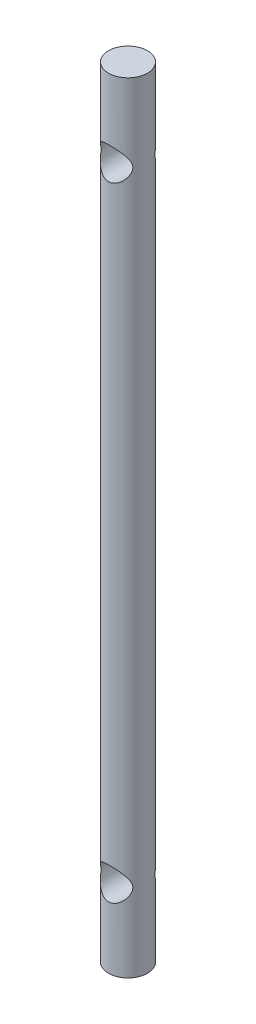
ISO-10303-21;
HEADER;
FILE_DESCRIPTION(('STEP AP214'),'2;1');
FILE_NAME('part.step','',(''),(''),'','','');
FILE_SCHEMA(('AUTOMOTIVE_DESIGN { 1 0 10303 214 1 1 1 1 }'));
ENDSEC;
DATA;
#1=APPLICATION_CONTEXT('core data for automotive mechanical design processes');
#2=APPLICATION_PROTOCOL_DEFINITION('international standard','automotive_design',2000,#1);
#3=PRODUCT_CONTEXT('',#1,'mechanical');
#4=PRODUCT('Part','Part','',(#3));
#5=PRODUCT_RELATED_PRODUCT_CATEGORY('part','',(#4));
#6=PRODUCT_DEFINITION_FORMATION('','',#4);
#7=PRODUCT_DEFINITION_CONTEXT('part definition',#1,'design');
#8=PRODUCT_DEFINITION('design','',#6,#7);
#9=PRODUCT_DEFINITION_SHAPE('','',#8);
#10=(LENGTH_UNIT() NAMED_UNIT(*) SI_UNIT(.MILLI.,.METRE.));
#11=(NAMED_UNIT(*) PLANE_ANGLE_UNIT() SI_UNIT($,.RADIAN.));
#12=(NAMED_UNIT(*) SI_UNIT($,.STERADIAN.) SOLID_ANGLE_UNIT());
#13=UNCERTAINTY_MEASURE_WITH_UNIT(LENGTH_MEASURE(1.E-05),#10,'distance_accuracy_value','');
#14=(GEOMETRIC_REPRESENTATION_CONTEXT(3) GLOBAL_UNCERTAINTY_ASSIGNED_CONTEXT((#13)) GLOBAL_UNIT_ASSIGNED_CONTEXT((#10,
#11,#12)) REPRESENTATION_CONTEXT('',''));
#15=CARTESIAN_POINT('',(0.,0.,0.));
#16=DIRECTION('',(0.,0.,1.));
#17=DIRECTION('',(1.,0.,0.));
#18=AXIS2_PLACEMENT_3D('',#15,#16,#17);
#19=CARTESIAN_POINT('',(0.,127.,0.));
#20=DIRECTION('',(0.,-1.,0.));
#21=DIRECTION('',(0.,0.,-1.));
#22=AXIS2_PLACEMENT_3D('',#19,#20,#21);
#23=CYLINDRICAL_SURFACE('',#22,3.175);
#24=CARTESIAN_POINT('',(0.,127.,0.));
#25=DIRECTION('',(0.,1.,0.));
#26=DIRECTION('',(0.,0.,1.));
#27=AXIS2_PLACEMENT_3D('',#24,#25,#26);
#28=CIRCLE('',#27,3.175);
#29=CARTESIAN_POINT('',(0.,127.,3.175));
#30=VERTEX_POINT('',#29);
#31=EDGE_CURVE('E10',#30,#30,#28,.T.);
#32=ORIENTED_EDGE('',*,*,#31,.F.);
#33=EDGE_LOOP('',(#32));
#34=FACE_BOUND('',#33,.T.);
#35=CARTESIAN_POINT('',(0.,0.,0.));
#36=DIRECTION('',(0.,1.,0.));
#37=DIRECTION('',(0.,0.,1.));
#38=AXIS2_PLACEMENT_3D('',#35,#36,#37);
#39=CIRCLE('',#38,3.175);
#40=CARTESIAN_POINT('',(0.,0.,3.175));
#41=VERTEX_POINT('',#40);
#42=EDGE_CURVE('E46',#41,#41,#39,.T.);
#43=ORIENTED_EDGE('',*,*,#42,.T.);
#44=EDGE_LOOP('',(#43));
#45=FACE_BOUND('',#44,.T.);
#46=CARTESIAN_POINT('',(-2.6035,12.7,1.81725417869928));
#47=CARTESIAN_POINT('',(-2.60349380703893,12.6056522915322,1.81726960519073));
#48=CARTESIAN_POINT('',(-2.59830904840763,12.5111405078217,1.82475945800134));
#49=CARTESIAN_POINT('',(-2.57808860042119,12.3251602366585,1.85320291134145));
#50=CARTESIAN_POINT('',(-2.56301943103733,12.2337032065457,1.87420226598136));
#51=CARTESIAN_POINT('',(-2.51694337247042,12.022627240234,1.93586405062697));
#52=CARTESIAN_POINT('',(-2.48209442276683,11.9051761393774,1.9809339390405));
#53=CARTESIAN_POINT('',(-2.39841904985947,11.6800407597469,2.08146538459981));
#54=CARTESIAN_POINT('',(-2.34954960473286,11.572387907154,2.13695874238255));
#55=CARTESIAN_POINT('',(-2.25541715860351,11.3969043389212,2.23537692454374));
#56=CARTESIAN_POINT('',(-2.2133430346896,11.3266945022097,2.27718022507128));
#57=CARTESIAN_POINT('',(-2.12304867110549,11.1908489097998,2.36159191688069));
#58=CARTESIAN_POINT('',(-2.07482597637227,11.1252149975039,2.40420062393305));
#59=CARTESIAN_POINT('',(-1.92114005012042,10.9353666398222,2.53129287769606));
#60=CARTESIAN_POINT('',(-1.80650430308042,10.8179184294719,2.61521372312124));
#61=CARTESIAN_POINT('',(-1.57945159624831,10.62615817513,2.75681725436884));
#62=CARTESIAN_POINT('',(-1.47145254679039,10.5479453202648,2.8163418253493));
#63=CARTESIAN_POINT('',(-1.24097732698785,10.40733046106,2.92519319791981));
#64=CARTESIAN_POINT('',(-1.11852469347476,10.3449032578057,2.97453622901349));
#65=CARTESIAN_POINT('',(-0.882754596866585,10.2479896804999,3.05189691940021));
#66=CARTESIAN_POINT('',(-0.771369427082402,10.2105688311945,3.08210619165948));
#67=CARTESIAN_POINT('',(-0.542099638614502,10.150815481225,3.13056626479759));
#68=CARTESIAN_POINT('',(-0.424218717568863,10.1284744905443,3.14882379437707));
#69=CARTESIAN_POINT('',(-0.184702399776176,10.1002525297829,3.17191312658879));
#70=CARTESIAN_POINT('',(-0.0630542442020661,10.0944355623768,3.17669272448434));
#71=CARTESIAN_POINT('',(0.179598439609459,10.0998688596393,3.1722376933656));
#72=CARTESIAN_POINT('',(0.300602973008787,10.1111189872204,3.16300317691645));
#73=CARTESIAN_POINT('',(0.530754495807861,10.1486722187031,3.13234403759877));
#74=CARTESIAN_POINT('',(0.640171714002751,10.1739998535061,3.1117098386675));
#75=CARTESIAN_POINT('',(0.852647558606555,10.237579592308,3.06032310242028));
#76=CARTESIAN_POINT('',(0.955704504285415,10.2758350954051,3.0295679040662));
#77=CARTESIAN_POINT('',(1.16279452849434,10.3676001702961,2.95662894565897));
#78=CARTESIAN_POINT('',(1.2660745726746,10.4221756446305,2.91366368632402));
#79=CARTESIAN_POINT('',(1.46207443006603,10.5427311167065,2.82041889385542));
#80=CARTESIAN_POINT('',(1.55478943860704,10.608716269169,2.77013605638324));
#81=CARTESIAN_POINT('',(1.74736466909495,10.7652216438746,2.65376673632885));
#82=CARTESIAN_POINT('',(1.84471745269194,10.8579919915534,2.58656568240451));
#83=CARTESIAN_POINT('',(2.02339604233255,11.0562445223615,2.44932530286629));
#84=CARTESIAN_POINT('',(2.10469763983113,11.1617455256786,2.37928187928248));
#85=CARTESIAN_POINT('',(2.24848726914474,11.3812196890884,2.24373588676197));
#86=CARTESIAN_POINT('',(2.31150741926268,11.4947985976659,2.1781597457541));
#87=CARTESIAN_POINT('',(2.42117649292599,11.7338994443531,2.05553877920543));
#88=CARTESIAN_POINT('',(2.46786131888551,11.8593944105906,1.99847540447659));
#89=CARTESIAN_POINT('',(2.52912696585605,12.0759078545479,1.91981912423537));
#90=CARTESIAN_POINT('',(2.5492213873144,12.1633570383594,1.89282496311961));
#91=CARTESIAN_POINT('',(2.58042133786671,12.3424311995639,1.85007036811107));
#92=CARTESIAN_POINT('',(2.59154938910397,12.4340450997925,1.83428179946868));
#93=CARTESIAN_POINT('',(2.60395334095435,12.6201217578389,1.81664298167926));
#94=CARTESIAN_POINT('',(2.60514737674104,12.7146017602056,1.81490855376892));
#95=CARTESIAN_POINT('',(2.59733303011709,12.9023006848884,1.82606625849704));
#96=CARTESIAN_POINT('',(2.58831318049629,12.995518070649,1.83897483097672));
#97=CARTESIAN_POINT('',(2.55818983228077,13.1961278594062,1.88070528016295));
#98=CARTESIAN_POINT('',(2.53503143895886,13.3026294075129,1.91219215437187));
#99=CARTESIAN_POINT('',(2.47715409814926,13.5083438569671,1.98658919501497));
#100=CARTESIAN_POINT('',(2.44239853217996,13.6075324405335,2.02953545771445));
#101=CARTESIAN_POINT('',(2.37187757105399,13.7764456503839,2.11116922838265));
#102=CARTESIAN_POINT('',(2.33818697759601,13.847696130628,2.14856077116876));
#103=CARTESIAN_POINT('',(2.26508109926628,13.9859784609942,2.22550176038988));
#104=CARTESIAN_POINT('',(2.22566296224328,14.0530081853242,2.26505227576864));
#105=CARTESIAN_POINT('',(2.09898018038973,14.24808755516,2.38503209760887));
#106=CARTESIAN_POINT('',(2.00330616957861,14.3700826149601,2.46676624298373));
#107=CARTESIAN_POINT('',(1.84210171074324,14.5415311546607,2.58688783587489));
#108=CARTESIAN_POINT('',(1.78450998934586,14.5974319232116,2.62704185301191));
#109=CARTESIAN_POINT('',(1.66355898166607,14.7043201667134,2.70524849645464));
#110=CARTESIAN_POINT('',(1.60019956353601,14.7553075292905,2.74330107469019));
#111=CARTESIAN_POINT('',(1.46797932136913,14.8517255573894,2.81626530862939));
#112=CARTESIAN_POINT('',(1.39913273588328,14.8971698770936,2.85118462395024));
#113=CARTESIAN_POINT('',(1.2560546202533,14.9819850768828,2.91704561602491));
#114=CARTESIAN_POINT('',(1.18182574004628,15.0213589162747,2.94798922966511));
#115=CARTESIAN_POINT('',(0.999413105069472,15.106859448454,3.01570335266716));
#116=CARTESIAN_POINT('',(0.888951563089919,15.14996386044,3.0502940300014));
#117=CARTESIAN_POINT('',(0.660433666577568,15.2211783058276,3.10778240966677));
#118=CARTESIAN_POINT('',(0.542383240561661,15.2492998882162,3.1306891175921));
#119=CARTESIAN_POINT('',(0.301034653873182,15.2889386678215,3.16304955150389));
#120=CARTESIAN_POINT('',(0.177712958272432,15.3003711105559,3.17243460571653));
#121=CARTESIAN_POINT('',(-0.0695487107797177,15.3055053283863,3.17664410680545));
#122=CARTESIAN_POINT('',(-0.193488604293605,15.2992093394575,3.17147038988767));
#123=CARTESIAN_POINT('',(-0.428208810946592,15.2705517809296,3.14802958864769));
#124=CARTESIAN_POINT('',(-0.539260005543839,15.2494857953008,3.13081865904161));
#125=CARTESIAN_POINT('',(-0.755647208780161,15.1939321240832,3.08574914882455));
#126=CARTESIAN_POINT('',(-0.860982389096538,15.1594424991261,3.0578890296919));
#127=CARTESIAN_POINT('',(-1.07072462242002,15.0759901930671,2.99116521603351));
#128=CARTESIAN_POINT('',(-1.17461764477315,15.0262266017417,2.95169965368096));
#129=CARTESIAN_POINT('',(-1.37254157716372,14.9152300957006,2.86504169788145));
#130=CARTESIAN_POINT('',(-1.46656491895475,14.8539884782238,2.81784344486658));
#131=CARTESIAN_POINT('',(-1.68524901110361,14.6910734064275,2.69493634929465));
#132=CARTESIAN_POINT('',(-1.80403918577009,14.5837795783829,2.61611808882817));
#133=CARTESIAN_POINT('',(-1.96516590073709,14.409567353474,2.49465758406211));
#134=CARTESIAN_POINT('',(-2.01609578271388,14.3491832441238,2.45356727170546));
#135=CARTESIAN_POINT('',(-2.11224457503145,14.2240887104516,2.37129603165292));
#136=CARTESIAN_POINT('',(-2.15746514344285,14.1593795505773,2.33011513381555));
#137=CARTESIAN_POINT('',(-2.26728826205007,13.985917221163,2.22458028123042));
#138=CARTESIAN_POINT('',(-2.32744666809876,13.8738351577155,2.16099283135989));
#139=CARTESIAN_POINT('',(-2.43194934699224,13.6382725322719,2.0426543650848));
#140=CARTESIAN_POINT('',(-2.47633599046081,13.5148236493447,1.98787989299024));
#141=CARTESIAN_POINT('',(-2.53529061200704,13.2988236228063,1.91166237827773));
#142=CARTESIAN_POINT('',(-2.55486432902738,13.2094574558188,1.88518150104208));
#143=CARTESIAN_POINT('',(-2.58457629617021,13.0266045031825,1.8442487329831));
#144=CARTESIAN_POINT('',(-2.59475037550996,12.9331347992831,1.82975118696474));
#145=CARTESIAN_POINT('',(-2.60102447982524,12.8158660417275,1.82079575180877));
#146=CARTESIAN_POINT('',(-2.60195127919733,12.7927266651667,1.81947139270039));
#147=CARTESIAN_POINT('',(-2.60318985311492,12.7463948389957,1.81769863473897));
#148=CARTESIAN_POINT('',(-2.60350152299875,12.723202381026,1.81725038495232));
#149=CARTESIAN_POINT('',(-2.6035,12.7,1.81725417869928));
#150=B_SPLINE_CURVE_WITH_KNOTS('',3,(#46,#47,#48,#49,#50,#51,#52,#53,#54,#55,#56,#57,#58,#59,
#60,#61,#62,#63,#64,#65,#66,#67,#68,#69,#70,#71,#72,#73,#74,#75,#76,#77,#78,#79,#80,#81,#82,#83,
#84,#85,#86,#87,#88,#89,#90,#91,#92,#93,#94,#95,#96,#97,#98,#99,#100,#101,#102,#103,#104,#105,
#106,#107,#108,#109,#110,#111,#112,#113,#114,#115,#116,#117,#118,#119,#120,#121,#122,#123,#124,
#125,#126,#127,#128,#129,#130,#131,#132,#133,#134,#135,#136,#137,#138,#139,#140,#141,#142,#143,
#144,#145,#146,#147,#148,#149),.UNSPECIFIED.,.T.,.F.,(4,2,2,2,2,2,2,2,2,2,2,2,2,2,2,2,2,2,2,2,2,
2,2,2,2,2,2,2,2,2,2,2,2,2,2,2,2,2,2,2,2,2,2,2,2,2,2,2,2,2,2,4),(0.,0.282939510307461,
0.566842363978402,0.956270704776369,1.34690702768739,1.62230695710977,1.89781719737606,
2.44774539088221,2.88426263354912,3.32007859335295,3.68252927239652,4.04477571977008,
4.40842335953073,4.77206807839132,5.11319028142707,5.45440224490685,5.82644196446266,
6.19865020723959,6.64806919839079,7.09816091444782,7.53340602702876,7.96768844192595,
8.24785671153458,8.52731902827848,8.80908209660932,9.09116181647813,9.42962283661691,
9.76916283494951,10.0305293359004,10.2920264387289,10.8151808853685,11.0841598691664,
11.3531450032797,11.6214535587844,11.8896308997666,12.2585823277594,12.6272489495625,
12.9977813798354,13.3682670792854,13.7097644119182,14.0513111003958,14.4152597845521,
14.7794855430674,15.3117004825252,15.5786168057556,15.8454554332829,16.2708086130978,
16.6950102905371,16.9797499495291,17.2633997147977,17.3329695404304,17.4025512020528),.UNSPECIFIED.);
#151=CARTESIAN_POINT('',(-2.6035,12.7,1.81725417869928));
#152=VERTEX_POINT('',#151);
#153=EDGE_CURVE('E53',#152,#152,#150,.T.);
#154=ORIENTED_EDGE('',*,*,#153,.F.);
#155=EDGE_LOOP('',(#154));
#156=FACE_BOUND('',#155,.T.);
#157=CARTESIAN_POINT('',(0.,15.3035,-3.175));
#158=CARTESIAN_POINT('',(0.124123475975315,15.3034893581908,-3.17498963844609));
#159=CARTESIAN_POINT('',(0.248399817811965,15.2945499532605,-3.16764822022756));
#160=CARTESIAN_POINT('',(0.492915685238948,15.2594097445047,-3.13893180286522));
#161=CARTESIAN_POINT('',(0.613147071737957,15.233176097969,-3.11753010274403));
#162=CARTESIAN_POINT('',(0.845370064526018,15.1653814220387,-3.06269871701765));
#163=CARTESIAN_POINT('',(0.95740883594244,15.123918058066,-3.02934570561062));
#164=CARTESIAN_POINT('',(1.1719899729014,15.0277668764952,-2.95297497446787));
#165=CARTESIAN_POINT('',(1.27453147910821,14.9730778638216,-2.90995638137086));
#166=CARTESIAN_POINT('',(1.50418874828167,14.8307009338172,-2.79992252111318));
#167=CARTESIAN_POINT('',(1.62685974340384,14.7382213815472,-2.72984396144292));
#168=CARTESIAN_POINT('',(1.85222572926916,14.5358996551492,-2.58226149625843));
#169=CARTESIAN_POINT('',(1.95486191966328,14.4260080387235,-2.50473670147969));
#170=CARTESIAN_POINT('',(2.09419892563397,14.2486486776039,-2.38720547545905));
#171=CARTESIAN_POINT('',(2.13853064808069,14.1868430792235,-2.34746698005741));
#172=CARTESIAN_POINT('',(2.22185003224185,14.0591943987958,-2.26876311834294));
#173=CARTESIAN_POINT('',(2.26083592730141,13.9933499923837,-2.2297980112354));
#174=CARTESIAN_POINT('',(2.33318274771518,13.8577398573863,-2.15397803623534));
#175=CARTESIAN_POINT('',(2.36655779505138,13.7879845812898,-2.11711802939653));
#176=CARTESIAN_POINT('',(2.42746797872266,13.6442963754813,-2.04699254721169));
#177=CARTESIAN_POINT('',(2.4550081415199,13.5703671115664,-2.01372399022973));
#178=CARTESIAN_POINT('',(2.50658873716791,13.40934482567,-1.94923911746055));
#179=CARTESIAN_POINT('',(2.52985620476328,13.3217181629825,-1.91870498324858));
#180=CARTESIAN_POINT('',(2.56739303486915,13.1417193499684,-1.86818689698901));
#181=CARTESIAN_POINT('',(2.58168481380992,13.0493596498964,-1.84817668237134));
#182=CARTESIAN_POINT('',(2.60028691219318,12.8605602665468,-1.82192817278465));
#183=CARTESIAN_POINT('',(2.60448888485103,12.7640875203456,-1.81583940257808));
#184=CARTESIAN_POINT('',(2.60211315740838,12.571537150346,-1.81923902416289));
#185=CARTESIAN_POINT('',(2.59553081649723,12.4754597144996,-1.82873412215905));
#186=CARTESIAN_POINT('',(2.57094397805907,12.2760690024166,-1.86315400856163));
#187=CARTESIAN_POINT('',(2.55170022727413,12.1732135391498,-1.88974469136245));
#188=CARTESIAN_POINT('',(2.50232253625902,11.9739084648961,-1.95464781624411));
#189=CARTESIAN_POINT('',(2.47215411497204,11.8774802940466,-1.992997312748));
#190=CARTESIAN_POINT('',(2.41011212928527,11.7123202113051,-2.06731302203854));
#191=CARTESIAN_POINT('',(2.38013051431426,11.6422189185222,-2.101892495004));
#192=CARTESIAN_POINT('',(2.31477445283779,11.5059559661491,-2.17366213153368));
#193=CARTESIAN_POINT('',(2.27939711926158,11.4397964421815,-2.21085368695476));
#194=CARTESIAN_POINT('',(2.16543772342221,11.2469181152341,-2.32442703413848));
#195=CARTESIAN_POINT('',(2.07905422537912,11.1258671508787,-2.40277435290893));
#196=CARTESIAN_POINT('',(1.88227893075192,10.8946766809139,-2.56012511257143));
#197=CARTESIAN_POINT('',(1.77105880109225,10.7851748312205,-2.6390273887326));
#198=CARTESIAN_POINT('',(1.5270779114991,10.5855394009579,-2.78727841350138));
#199=CARTESIAN_POINT('',(1.39437058393797,10.4953590337454,-2.85665009058514));
#200=CARTESIAN_POINT('',(1.14717455706693,10.3598303714,-2.96269415784094));
#201=CARTESIAN_POINT('',(1.03734481071852,10.3089448591673,-3.00314655826614));
#202=CARTESIAN_POINT('',(0.808472770456184,10.2221942364831,-3.07266264818784));
#203=CARTESIAN_POINT('',(0.689437039605883,10.1863185401902,-3.10173436310676));
#204=CARTESIAN_POINT('',(0.444137934137689,10.1315699656462,-3.14626597447226));
#205=CARTESIAN_POINT('',(0.317832509624789,10.112809427501,-3.16163592073425));
#206=CARTESIAN_POINT('',(0.0629120037225163,10.0941295640756,-3.17693912736038));
#207=CARTESIAN_POINT('',(-0.0657020679860151,10.0942021936836,-3.17687897911894));
#208=CARTESIAN_POINT('',(-0.307380967024342,10.112164759431,-3.16216462368221));
#209=CARTESIAN_POINT('',(-0.420683678390824,10.1282200119679,-3.14901320282353));
#210=CARTESIAN_POINT('',(-0.642383248669001,10.1744534621768,-3.11136927044028));
#211=CARTESIAN_POINT('',(-0.750779218579718,10.2046342079558,-3.08687471272837));
#212=CARTESIAN_POINT('',(-0.964119386725469,10.2788642094524,-3.02717779548715));
#213=CARTESIAN_POINT('',(-1.06880671667246,10.3233653623829,-2.99162801371886));
#214=CARTESIAN_POINT('',(-1.26901924959805,10.4239559720396,-2.9123596023041));
#215=CARTESIAN_POINT('',(-1.36454176445307,10.4800488135905,-2.86863858697831));
#216=CARTESIAN_POINT('',(-1.58678190557676,10.6298485880596,-2.75401917991626));
#217=CARTESIAN_POINT('',(-1.70808861490192,10.7290981722438,-2.67976797972566));
#218=CARTESIAN_POINT('',(-1.87403957004749,10.8910751115127,-2.56382769666462));
#219=CARTESIAN_POINT('',(-1.92679707161641,10.9474043435339,-2.52431861471153));
#220=CARTESIAN_POINT('',(-2.02691784622182,11.0642350861497,-2.44464891997431));
#221=CARTESIAN_POINT('',(-2.07428337510765,11.1247348347821,-2.40448858774876));
#222=CARTESIAN_POINT('',(-2.16433735799769,11.2508734660719,-2.32378756743908));
#223=CARTESIAN_POINT('',(-2.20693199095685,11.3165825337329,-2.2832521174344));
#224=CARTESIAN_POINT('',(-2.28640153755374,11.4522954993897,-2.20366818575308));
#225=CARTESIAN_POINT('',(-2.32327376010173,11.522301396599,-2.16462041016165));
#226=CARTESIAN_POINT('',(-2.39086352498482,11.6664187065179,-2.08971969393377));
#227=CARTESIAN_POINT('',(-2.42160771889491,11.7405104687395,-2.05385331274569));
#228=CARTESIAN_POINT('',(-2.4766450600724,11.8931462093896,-1.98713910557181));
#229=CARTESIAN_POINT('',(-2.50094648664365,11.9716843148846,-1.95628485867469));
#230=CARTESIAN_POINT('',(-2.54327599370942,12.1365419418237,-1.90095794348242));
#231=CARTESIAN_POINT('',(-2.56100550798422,12.2230485609389,-1.87679933394888));
#232=CARTESIAN_POINT('',(-2.5876534922232,12.3996743541574,-1.83989414331906));
#233=CARTESIAN_POINT('',(-2.59659432871273,12.4897837473916,-1.82711860097366));
#234=CARTESIAN_POINT('',(-2.60495254879583,12.6719743701564,-1.81518976727652));
#235=CARTESIAN_POINT('',(-2.60430968129299,12.7640644369915,-1.81612265795785));
#236=CARTESIAN_POINT('',(-2.59341679087731,12.9465617189978,-1.8316354853639));
#237=CARTESIAN_POINT('',(-2.58315195253364,13.0369661196851,-1.8462364674874));
#238=CARTESIAN_POINT('',(-2.5499767392694,13.2373457338148,-1.89188125022431));
#239=CARTESIAN_POINT('',(-2.52441782222472,13.3460856322685,-1.92627916500784));
#240=CARTESIAN_POINT('',(-2.46129495688756,13.5557524115751,-2.00629861106379));
#241=CARTESIAN_POINT('',(-2.42369344788066,13.6566536035454,-2.05195515399701));
#242=CARTESIAN_POINT('',(-2.34811300923828,13.8274201085521,-2.13762622484278));
#243=CARTESIAN_POINT('',(-2.3123694365922,13.8989419316214,-2.17638361196673));
#244=CARTESIAN_POINT('',(-2.23498804969183,14.0376677938319,-2.25577612111847));
#245=CARTESIAN_POINT('',(-2.19334745554496,14.1048697747249,-2.29641212261646));
#246=CARTESIAN_POINT('',(-2.10429577317291,14.2350471754542,-2.37828173675715));
#247=CARTESIAN_POINT('',(-2.05688038011101,14.2980193872737,-2.41951577478704));
#248=CARTESIAN_POINT('',(-1.95637146026665,14.4196090843916,-2.501491203949));
#249=CARTESIAN_POINT('',(-1.90327499764467,14.4782242913211,-2.54223232813259));
#250=CARTESIAN_POINT('',(-1.73319854916753,14.6494667705426,-2.6638779775387));
#251=CARTESIAN_POINT('',(-1.60709272871657,14.7550378490434,-2.74259807229654));
#252=CARTESIAN_POINT('',(-1.40107169928095,14.8959321412804,-2.85020133536394));
#253=CARTESIAN_POINT('',(-1.3296436989684,14.9399617146146,-2.88430266583609));
#254=CARTESIAN_POINT('',(-1.18137409748014,15.0215773493966,-2.94813161513575));
#255=CARTESIAN_POINT('',(-1.104535866589,15.0591673730986,-2.97786192184531));
#256=CARTESIAN_POINT('',(-0.918815482353828,15.1387236442481,-3.04122104053275));
#257=CARTESIAN_POINT('',(-0.807938741999642,15.1778137225613,-3.07272413283516));
#258=CARTESIAN_POINT('',(-0.579524537035575,15.2409306364849,-3.12384313970282));
#259=CARTESIAN_POINT('',(-0.462004057715175,15.2649941444195,-3.14348799034807));
#260=CARTESIAN_POINT('',(-0.286186339215518,15.2883557663721,-3.16259123109925));
#261=CARTESIAN_POINT('',(-0.229212891132946,15.2940230137984,-3.16723273070072));
#262=CARTESIAN_POINT('',(-0.114837276221354,15.3015980735956,-3.17343990585332));
#263=CARTESIAN_POINT('',(-0.0574350034855266,15.3035049242284,-3.17500479454737));
#264=CARTESIAN_POINT('',(0.,15.3035,-3.175));
#265=B_SPLINE_CURVE_WITH_KNOTS('',3,(#157,#158,#159,#160,#161,#162,#163,#164,#165,#166,#167,
#168,#169,#170,#171,#172,#173,#174,#175,#176,#177,#178,#179,#180,#181,#182,#183,#184,#185,#186,
#187,#188,#189,#190,#191,#192,#193,#194,#195,#196,#197,#198,#199,#200,#201,#202,#203,#204,#205,
#206,#207,#208,#209,#210,#211,#212,#213,#214,#215,#216,#217,#218,#219,#220,#221,#222,#223,#224,
#225,#226,#227,#228,#229,#230,#231,#232,#233,#234,#235,#236,#237,#238,#239,#240,#241,#242,#243,
#244,#245,#246,#247,#248,#249,#250,#251,#252,#253,#254,#255,#256,#257,#258,#259,#260,#261,#262,
#263,#264),.UNSPECIFIED.,.T.,.F.,(4,2,2,2,2,2,2,2,2,2,2,2,2,2,2,2,2,2,2,2,2,2,2,2,2,2,2,2,2,2,2,
2,2,2,2,2,2,2,2,2,2,2,2,2,2,2,2,2,2,2,2,2,2,4),(0.,0.372121110694421,0.744950943333155,
1.11543047898384,1.48594350384491,1.98985717146685,2.49522824914305,2.75246608989208,
3.00978873712746,3.2664537027931,3.5228966572058,3.80899396390969,4.09437388234913,
4.3828048387436,4.67135994815551,4.9934707245097,5.31660715494334,5.56744032301252,
5.81840817754303,6.32058007927765,6.84302172556955,7.36418362095611,7.74557593347973,
8.12669880951135,8.5103056608347,8.89374864408524,9.23772429777365,9.58176202538152,
9.93794272365023,10.2942275756089,10.811523950299,11.0714401134858,11.331247132299,
11.5954965586165,11.8598698799377,12.1230670389827,12.3859243178263,12.6595749069379,
12.9325272587596,13.2071963347532,13.4822890284081,13.8309834168996,14.1807761477987,
14.4470195601506,14.7133889016922,14.9799580383926,15.2466656030871,15.7900820157553,
16.0614094448483,16.3325693218519,16.6961622614931,17.0588643491009,17.2310099730123,
17.4031996182171),.UNSPECIFIED.);
#266=CARTESIAN_POINT('',(0.,15.3035,-3.175));
#267=VERTEX_POINT('',#266);
#268=EDGE_CURVE('E60',#267,#267,#265,.T.);
#269=ORIENTED_EDGE('',*,*,#268,.F.);
#270=EDGE_LOOP('',(#269));
#271=FACE_BOUND('',#270,.T.);
#272=CARTESIAN_POINT('',(-2.6035,114.3,1.81725417869929));
#273=CARTESIAN_POINT('',(-2.60349380703893,114.205652291532,1.81726960519073));
#274=CARTESIAN_POINT('',(-2.59830904840762,114.111140507822,1.82475945800134));
#275=CARTESIAN_POINT('',(-2.57808860042119,113.925160236658,1.85320291134146));
#276=CARTESIAN_POINT('',(-2.56301943103732,113.833703206546,1.87420226598137));
#277=CARTESIAN_POINT('',(-2.51694337247042,113.622627240234,1.93586405062697));
#278=CARTESIAN_POINT('',(-2.48209442276684,113.505176139377,1.9809339390405));
#279=CARTESIAN_POINT('',(-2.39841904985947,113.280040759747,2.08146538459981));
#280=CARTESIAN_POINT('',(-2.34954960473286,113.172387907154,2.13695874238255));
#281=CARTESIAN_POINT('',(-2.25541715860351,112.996904338921,2.23537692454374));
#282=CARTESIAN_POINT('',(-2.2133430346896,112.92669450221,2.27718022507128));
#283=CARTESIAN_POINT('',(-2.12304867110549,112.7908489098,2.36159191688069));
#284=CARTESIAN_POINT('',(-2.07482597637227,112.725214997504,2.40420062393305));
#285=CARTESIAN_POINT('',(-1.92114005012042,112.535366639822,2.53129287769606));
#286=CARTESIAN_POINT('',(-1.80650430308042,112.417918429472,2.61521372312124));
#287=CARTESIAN_POINT('',(-1.57945159624831,112.22615817513,2.75681725436883));
#288=CARTESIAN_POINT('',(-1.47145254679039,112.147945320265,2.8163418253493));
#289=CARTESIAN_POINT('',(-1.24097732698785,112.00733046106,2.92519319791981));
#290=CARTESIAN_POINT('',(-1.11852469347476,111.944903257806,2.97453622901349));
#291=CARTESIAN_POINT('',(-0.882754596866592,111.8479896805,3.05189691940021));
#292=CARTESIAN_POINT('',(-0.771369427082407,111.810568831194,3.08210619165948));
#293=CARTESIAN_POINT('',(-0.542099638614508,111.750815481225,3.13056626479759));
#294=CARTESIAN_POINT('',(-0.42421871756887,111.728474490544,3.14882379437707));
#295=CARTESIAN_POINT('',(-0.184702399776182,111.700252529783,3.17191312658879));
#296=CARTESIAN_POINT('',(-0.0630542442020717,111.694435562377,3.17669272448434));
#297=CARTESIAN_POINT('',(0.179598439609456,111.699868859639,3.17223769336561));
#298=CARTESIAN_POINT('',(0.300602973008784,111.71111898722,3.16300317691645));
#299=CARTESIAN_POINT('',(0.53075449580786,111.748672218703,3.13234403759877));
#300=CARTESIAN_POINT('',(0.640171714002751,111.773999853506,3.1117098386675));
#301=CARTESIAN_POINT('',(0.852647558606554,111.837579592308,3.06032310242028));
#302=CARTESIAN_POINT('',(0.955704504285413,111.875835095405,3.0295679040662));
#303=CARTESIAN_POINT('',(1.16279452849433,111.967600170296,2.95662894565898));
#304=CARTESIAN_POINT('',(1.2660745726746,112.02217564463,2.91366368632403));
#305=CARTESIAN_POINT('',(1.46207443006603,112.142731116706,2.82041889385542));
#306=CARTESIAN_POINT('',(1.55478943860703,112.208716269169,2.77013605638324));
#307=CARTESIAN_POINT('',(1.74736466909494,112.365221643875,2.65376673632886));
#308=CARTESIAN_POINT('',(1.84471745269193,112.457991991553,2.58656568240452));
#309=CARTESIAN_POINT('',(2.02339604233254,112.656244522362,2.44932530286629));
#310=CARTESIAN_POINT('',(2.10469763983112,112.761745525679,2.37928187928248));
#311=CARTESIAN_POINT('',(2.24848726914474,112.981219689088,2.24373588676197));
#312=CARTESIAN_POINT('',(2.31150741926268,113.094798597666,2.1781597457541));
#313=CARTESIAN_POINT('',(2.42117649292599,113.333899444353,2.05553877920544));
#314=CARTESIAN_POINT('',(2.4678613188855,113.459394410591,1.99847540447659));
#315=CARTESIAN_POINT('',(2.52912696585605,113.675907854548,1.91981912423537));
#316=CARTESIAN_POINT('',(2.5492213873144,113.763357038359,1.89282496311961));
#317=CARTESIAN_POINT('',(2.5804213378667,113.942431199564,1.85007036811107));
#318=CARTESIAN_POINT('',(2.59154938910396,114.034045099793,1.83428179946869));
#319=CARTESIAN_POINT('',(2.60395334095435,114.220121757839,1.81664298167926));
#320=CARTESIAN_POINT('',(2.60514737674104,114.314601760206,1.81490855376892));
#321=CARTESIAN_POINT('',(2.59733303011709,114.502300684888,1.82606625849704));
#322=CARTESIAN_POINT('',(2.58831318049629,114.595518070649,1.83897483097673));
#323=CARTESIAN_POINT('',(2.55818983228077,114.796127859406,1.88070528016295));
#324=CARTESIAN_POINT('',(2.53503143895886,114.902629407513,1.91219215437188));
#325=CARTESIAN_POINT('',(2.47715409814926,115.108343856967,1.98658919501497));
#326=CARTESIAN_POINT('',(2.44239853217996,115.207532440533,2.02953545771445));
#327=CARTESIAN_POINT('',(2.37187757105399,115.376445650384,2.11116922838265));
#328=CARTESIAN_POINT('',(2.33818697759601,115.447696130628,2.14856077116876));
#329=CARTESIAN_POINT('',(2.26508109926627,115.585978460994,2.22550176038988));
#330=CARTESIAN_POINT('',(2.22566296224327,115.653008185324,2.26505227576865));
#331=CARTESIAN_POINT('',(2.09898018038973,115.84808755516,2.38503209760888));
#332=CARTESIAN_POINT('',(2.0033061695786,115.97008261496,2.46676624298374));
#333=CARTESIAN_POINT('',(1.84210171074323,116.141531154661,2.58688783587489));
#334=CARTESIAN_POINT('',(1.78450998934586,116.197431923212,2.62704185301191));
#335=CARTESIAN_POINT('',(1.66355898166607,116.304320166713,2.70524849645464));
#336=CARTESIAN_POINT('',(1.60019956353601,116.355307529291,2.74330107469019));
#337=CARTESIAN_POINT('',(1.46797932136913,116.451725557389,2.81626530862939));
#338=CARTESIAN_POINT('',(1.39913273588328,116.497169877094,2.85118462395024));
#339=CARTESIAN_POINT('',(1.2560546202533,116.581985076883,2.91704561602491));
#340=CARTESIAN_POINT('',(1.18182574004628,116.621358916275,2.94798922966511));
#341=CARTESIAN_POINT('',(0.999413105069472,116.706859448454,3.01570335266716));
#342=CARTESIAN_POINT('',(0.888951563089917,116.74996386044,3.0502940300014));
#343=CARTESIAN_POINT('',(0.660433666577566,116.821178305828,3.10778240966677));
#344=CARTESIAN_POINT('',(0.54238324056166,116.849299888216,3.1306891175921));
#345=CARTESIAN_POINT('',(0.301034653873183,116.888938667821,3.16304955150389));
#346=CARTESIAN_POINT('',(0.177712958272434,116.900371110556,3.17243460571653));
#347=CARTESIAN_POINT('',(-0.0695487107797169,116.905505328386,3.17664410680545));
#348=CARTESIAN_POINT('',(-0.193488604293604,116.899209339458,3.17147038988767));
#349=CARTESIAN_POINT('',(-0.42820881094659,116.87055178093,3.14802958864769));
#350=CARTESIAN_POINT('',(-0.539260005543836,116.849485795301,3.13081865904161));
#351=CARTESIAN_POINT('',(-0.755647208780159,116.793932124083,3.08574914882455));
#352=CARTESIAN_POINT('',(-0.860982389096537,116.759442499126,3.0578890296919));
#353=CARTESIAN_POINT('',(-1.07072462242002,116.675990193067,2.99116521603351));
#354=CARTESIAN_POINT('',(-1.17461764477315,116.626226601742,2.95169965368096));
#355=CARTESIAN_POINT('',(-1.37254157716372,116.515230095701,2.86504169788145));
#356=CARTESIAN_POINT('',(-1.46656491895475,116.453988478224,2.81784344486658));
#357=CARTESIAN_POINT('',(-1.68524901110361,116.291073406427,2.69493634929465));
#358=CARTESIAN_POINT('',(-1.80403918577009,116.183779578383,2.61611808882817));
#359=CARTESIAN_POINT('',(-1.96516590073708,116.009567353474,2.49465758406211));
#360=CARTESIAN_POINT('',(-2.01609578271388,115.949183244124,2.45356727170546));
#361=CARTESIAN_POINT('',(-2.11224457503144,115.824088710452,2.37129603165292));
#362=CARTESIAN_POINT('',(-2.15746514344285,115.759379550577,2.33011513381556));
#363=CARTESIAN_POINT('',(-2.26728826205007,115.585917221163,2.22458028123042));
#364=CARTESIAN_POINT('',(-2.32744666809875,115.473835157716,2.16099283135989));
#365=CARTESIAN_POINT('',(-2.43194934699223,115.238272532272,2.04265436508481));
#366=CARTESIAN_POINT('',(-2.4763359904608,115.114823649345,1.98787989299025));
#367=CARTESIAN_POINT('',(-2.53529061200703,114.898823622806,1.91166237827774));
#368=CARTESIAN_POINT('',(-2.55486432902738,114.809457455819,1.88518150104209));
#369=CARTESIAN_POINT('',(-2.58457629617021,114.626604503183,1.84424873298311));
#370=CARTESIAN_POINT('',(-2.59475037550996,114.533134799283,1.82975118696475));
#371=CARTESIAN_POINT('',(-2.60102447982524,114.415866041728,1.82079575180877));
#372=CARTESIAN_POINT('',(-2.60195127919733,114.392726665167,1.81947139270039));
#373=CARTESIAN_POINT('',(-2.60318985311492,114.346394838996,1.81769863473897));
#374=CARTESIAN_POINT('',(-2.60350152299875,114.323202381026,1.81725038495232));
#375=CARTESIAN_POINT('',(-2.6035,114.3,1.81725417869929));
#376=B_SPLINE_CURVE_WITH_KNOTS('',3,(#272,#273,#274,#275,#276,#277,#278,#279,#280,#281,#282,
#283,#284,#285,#286,#287,#288,#289,#290,#291,#292,#293,#294,#295,#296,#297,#298,#299,#300,#301,
#302,#303,#304,#305,#306,#307,#308,#309,#310,#311,#312,#313,#314,#315,#316,#317,#318,#319,#320,
#321,#322,#323,#324,#325,#326,#327,#328,#329,#330,#331,#332,#333,#334,#335,#336,#337,#338,#339,
#340,#341,#342,#343,#344,#345,#346,#347,#348,#349,#350,#351,#352,#353,#354,#355,#356,#357,#358,
#359,#360,#361,#362,#363,#364,#365,#366,#367,#368,#369,#370,#371,#372,#373,#374,#375),
.UNSPECIFIED.,.T.,.F.,(4,2,2,2,2,2,2,2,2,2,2,2,2,2,2,2,2,2,2,2,2,2,2,2,2,2,2,2,2,2,2,2,2,2,2,2,
2,2,2,2,2,2,2,2,2,2,2,2,2,2,2,4),(0.,0.282939510307457,0.566842363978407,0.956270704776367,
1.34690702768738,1.62230695710978,1.89781719737605,2.4477453908822,2.8842626335491,
3.32007859335294,3.6825292723965,4.04477571977007,4.40842335953072,4.77206807839131,
5.11319028142707,5.45440224490684,5.82644196446265,6.19865020723958,6.64806919839077,
7.0981609144478,7.53340602702874,7.96768844192593,8.24785671153458,8.52731902827847,
8.80908209660929,9.09116181647811,9.42962283661691,9.76916283494949,10.0305293359004,
10.2920264387288,10.8151808853685,11.0841598691664,11.3531450032797,11.6214535587843,
11.8896308997666,12.2585823277594,12.6272489495625,12.9977813798354,13.3682670792854,
13.7097644119181,14.0513111003958,14.415259784552,14.7794855430674,15.3117004825252,
15.5786168057556,15.8454554332829,16.2708086130977,16.695010290537,16.9797499495291,
17.2633997147977,17.3329695404304,17.4025512020528),.UNSPECIFIED.);
#377=CARTESIAN_POINT('',(-2.6035,114.3,1.81725417869929));
#378=VERTEX_POINT('',#377);
#379=EDGE_CURVE('E94',#378,#378,#376,.T.);
#380=ORIENTED_EDGE('',*,*,#379,.F.);
#381=EDGE_LOOP('',(#380));
#382=FACE_BOUND('',#381,.T.);
#383=CARTESIAN_POINT('',(0.,116.9035,-3.175));
#384=CARTESIAN_POINT('',(0.124123475975316,116.903489358191,-3.17498963844609));
#385=CARTESIAN_POINT('',(0.248399817811967,116.89454995326,-3.16764822022756));
#386=CARTESIAN_POINT('',(0.492915685238949,116.859409744505,-3.13893180286522));
#387=CARTESIAN_POINT('',(0.613147071737956,116.833176097969,-3.11753010274403));
#388=CARTESIAN_POINT('',(0.845370064526017,116.765381422039,-3.06269871701765));
#389=CARTESIAN_POINT('',(0.957408835942438,116.723918058066,-3.02934570561062));
#390=CARTESIAN_POINT('',(1.1719899729014,116.627766876495,-2.95297497446787));
#391=CARTESIAN_POINT('',(1.2745314791082,116.573077863822,-2.90995638137086));
#392=CARTESIAN_POINT('',(1.50418874828167,116.430700933817,-2.79992252111318));
#393=CARTESIAN_POINT('',(1.62685974340384,116.338221381547,-2.72984396144292));
#394=CARTESIAN_POINT('',(1.85222572926917,116.135899655149,-2.58226149625843));
#395=CARTESIAN_POINT('',(1.95486191966328,116.026008038724,-2.50473670147969));
#396=CARTESIAN_POINT('',(2.09419892563397,115.848648677604,-2.38720547545904));
#397=CARTESIAN_POINT('',(2.13853064808069,115.786843079223,-2.34746698005741));
#398=CARTESIAN_POINT('',(2.22185003224186,115.659194398796,-2.26876311834293));
#399=CARTESIAN_POINT('',(2.26083592730141,115.593349992384,-2.2297980112354));
#400=CARTESIAN_POINT('',(2.33318274771518,115.457739857386,-2.15397803623534));
#401=CARTESIAN_POINT('',(2.36655779505138,115.38798458129,-2.11711802939653));
#402=CARTESIAN_POINT('',(2.42746797872266,115.244296375481,-2.04699254721169));
#403=CARTESIAN_POINT('',(2.4550081415199,115.170367111566,-2.01372399022972));
#404=CARTESIAN_POINT('',(2.50658873716791,115.00934482567,-1.94923911746055));
#405=CARTESIAN_POINT('',(2.52985620476328,114.921718162982,-1.91870498324858));
#406=CARTESIAN_POINT('',(2.56739303486915,114.741719349968,-1.86818689698901));
#407=CARTESIAN_POINT('',(2.58168481380991,114.649359649896,-1.84817668237134));
#408=CARTESIAN_POINT('',(2.60028691219318,114.460560266547,-1.82192817278466));
#409=CARTESIAN_POINT('',(2.60448888485103,114.364087520346,-1.81583940257808));
#410=CARTESIAN_POINT('',(2.60211315740838,114.171537150346,-1.8192390241629));
#411=CARTESIAN_POINT('',(2.59553081649723,114.0754597145,-1.82873412215905));
#412=CARTESIAN_POINT('',(2.57094397805907,113.876069002417,-1.86315400856163));
#413=CARTESIAN_POINT('',(2.55170022727413,113.77321353915,-1.88974469136245));
#414=CARTESIAN_POINT('',(2.50232253625902,113.573908464896,-1.95464781624411));
#415=CARTESIAN_POINT('',(2.47215411497204,113.477480294047,-1.992997312748));
#416=CARTESIAN_POINT('',(2.41011212928528,113.312320211305,-2.06731302203853));
#417=CARTESIAN_POINT('',(2.38013051431427,113.242218918522,-2.10189249500399));
#418=CARTESIAN_POINT('',(2.31477445283781,113.105955966149,-2.17366213153367));
#419=CARTESIAN_POINT('',(2.27939711926159,113.039796442182,-2.21085368695475));
#420=CARTESIAN_POINT('',(2.16543772342223,112.846918115234,-2.32442703413846));
#421=CARTESIAN_POINT('',(2.07905422537914,112.725867150879,-2.40277435290891));
#422=CARTESIAN_POINT('',(1.88227893075196,112.494676680914,-2.56012511257141));
#423=CARTESIAN_POINT('',(1.77105880109229,112.385174831221,-2.63902738873258));
#424=CARTESIAN_POINT('',(1.52707791149914,112.185539400958,-2.78727841350136));
#425=CARTESIAN_POINT('',(1.39437058393801,112.095359033745,-2.85665009058511));
#426=CARTESIAN_POINT('',(1.14717455706698,111.9598303714,-2.96269415784092));
#427=CARTESIAN_POINT('',(1.03734481071858,111.908944859167,-3.00314655826613));
#428=CARTESIAN_POINT('',(0.808472770456241,111.822194236483,-3.07266264818783));
#429=CARTESIAN_POINT('',(0.689437039605939,111.78631854019,-3.10173436310675));
#430=CARTESIAN_POINT('',(0.444137934137745,111.731569965646,-3.14626597447225));
#431=CARTESIAN_POINT('',(0.317832509624844,111.712809427501,-3.16163592073424));
#432=CARTESIAN_POINT('',(0.0629120037225682,111.694129564076,-3.17693912736037));
#433=CARTESIAN_POINT('',(-0.0657020679859661,111.694202193684,-3.17687897911894));
#434=CARTESIAN_POINT('',(-0.307380967024296,111.712164759431,-3.16216462368221));
#435=CARTESIAN_POINT('',(-0.420683678390778,111.728220011968,-3.14901320282353));
#436=CARTESIAN_POINT('',(-0.642383248668957,111.774453462177,-3.11136927044029));
#437=CARTESIAN_POINT('',(-0.750779218579675,111.804634207956,-3.08687471272838));
#438=CARTESIAN_POINT('',(-0.964119386725428,111.878864209452,-3.02717779548716));
#439=CARTESIAN_POINT('',(-1.06880671667242,111.923365362383,-2.99162801371887));
#440=CARTESIAN_POINT('',(-1.26901924959801,112.02395597204,-2.91235960230412));
#441=CARTESIAN_POINT('',(-1.36454176445303,112.08004881359,-2.86863858697833));
#442=CARTESIAN_POINT('',(-1.58678190557673,112.22984858806,-2.75401917991628));
#443=CARTESIAN_POINT('',(-1.70808861490188,112.329098172244,-2.67976797972568));
#444=CARTESIAN_POINT('',(-1.87403957004745,112.491075111513,-2.56382769666465));
#445=CARTESIAN_POINT('',(-1.92679707161638,112.547404343534,-2.52431861471156));
#446=CARTESIAN_POINT('',(-2.02691784622179,112.66423508615,-2.44464891997434));
#447=CARTESIAN_POINT('',(-2.07428337510762,112.724734834782,-2.40448858774879));
#448=CARTESIAN_POINT('',(-2.16433735799766,112.850873466072,-2.3237875674391));
#449=CARTESIAN_POINT('',(-2.20693199095681,112.916582533733,-2.28325211743443));
#450=CARTESIAN_POINT('',(-2.28640153755372,113.05229549939,-2.20366818575311));
#451=CARTESIAN_POINT('',(-2.3232737601017,113.122301396599,-2.16462041016168));
#452=CARTESIAN_POINT('',(-2.3908635249848,113.266418706518,-2.0897196939338));
#453=CARTESIAN_POINT('',(-2.42160771889488,113.340510468739,-2.05385331274571));
#454=CARTESIAN_POINT('',(-2.47664506007238,113.49314620939,-1.98713910557183));
#455=CARTESIAN_POINT('',(-2.50094648664363,113.571684314885,-1.95628485867471));
#456=CARTESIAN_POINT('',(-2.54327599370941,113.736541941824,-1.90095794348244));
#457=CARTESIAN_POINT('',(-2.56100550798421,113.823048560939,-1.8767993339489));
#458=CARTESIAN_POINT('',(-2.5876534922232,113.999674354157,-1.83989414331907));
#459=CARTESIAN_POINT('',(-2.59659432871272,114.089783747392,-1.82711860097367));
#460=CARTESIAN_POINT('',(-2.60495254879582,114.271974370156,-1.81518976727652));
#461=CARTESIAN_POINT('',(-2.60430968129299,114.364064436991,-1.81612265795785));
#462=CARTESIAN_POINT('',(-2.59341679087731,114.546561718998,-1.83163548536389));
#463=CARTESIAN_POINT('',(-2.58315195253364,114.636966119685,-1.84623646748739));
#464=CARTESIAN_POINT('',(-2.54997673926941,114.837345733815,-1.8918812502243));
#465=CARTESIAN_POINT('',(-2.52441782222473,114.946085632268,-1.92627916500783));
#466=CARTESIAN_POINT('',(-2.46129495688758,115.155752411575,-2.00629861106377));
#467=CARTESIAN_POINT('',(-2.42369344788068,115.256653603545,-2.05195515399699));
#468=CARTESIAN_POINT('',(-2.34811300923831,115.427420108552,-2.13762622484275));
#469=CARTESIAN_POINT('',(-2.31236943659223,115.498941931621,-2.17638361196669));
#470=CARTESIAN_POINT('',(-2.23498804969186,115.637667793832,-2.25577612111844));
#471=CARTESIAN_POINT('',(-2.19334745554499,115.704869774725,-2.29641212261642));
#472=CARTESIAN_POINT('',(-2.10429577317294,115.835047175454,-2.37828173675712));
#473=CARTESIAN_POINT('',(-2.05688038011105,115.898019387274,-2.41951577478701));
#474=CARTESIAN_POINT('',(-1.95637146026669,116.019609084392,-2.50149120394897));
#475=CARTESIAN_POINT('',(-1.90327499764471,116.078224291321,-2.54223232813255));
#476=CARTESIAN_POINT('',(-1.73319854916759,116.249466770543,-2.66387797753866));
#477=CARTESIAN_POINT('',(-1.60709272871663,116.355037849043,-2.74259807229651));
#478=CARTESIAN_POINT('',(-1.40107169928102,116.49593214128,-2.8502013353639));
#479=CARTESIAN_POINT('',(-1.32964369896847,116.539961714615,-2.88430266583606));
#480=CARTESIAN_POINT('',(-1.18137409748022,116.621577349397,-2.94813161513572));
#481=CARTESIAN_POINT('',(-1.10453586658908,116.659167373099,-2.97786192184528));
#482=CARTESIAN_POINT('',(-0.918815482353908,116.738723644248,-3.04122104053273));
#483=CARTESIAN_POINT('',(-0.807938741999722,116.777813722561,-3.07272413283514));
#484=CARTESIAN_POINT('',(-0.579524537035654,116.840930636485,-3.1238431397028));
#485=CARTESIAN_POINT('',(-0.462004057715254,116.86499414442,-3.14348799034806));
#486=CARTESIAN_POINT('',(-0.286186339215584,116.888355766372,-3.16259123109924));
#487=CARTESIAN_POINT('',(-0.229212891132998,116.894023013798,-3.16723273070072));
#488=CARTESIAN_POINT('',(-0.11483727622138,116.901598073596,-3.17343990585332));
#489=CARTESIAN_POINT('',(-0.0574350034855395,116.903504924228,-3.17500479454737));
#490=CARTESIAN_POINT('',(0.,116.9035,-3.175));
#491=B_SPLINE_CURVE_WITH_KNOTS('',3,(#383,#384,#385,#386,#387,#388,#389,#390,#391,#392,#393,
#394,#395,#396,#397,#398,#399,#400,#401,#402,#403,#404,#405,#406,#407,#408,#409,#410,#411,#412,
#413,#414,#415,#416,#417,#418,#419,#420,#421,#422,#423,#424,#425,#426,#427,#428,#429,#430,#431,
#432,#433,#434,#435,#436,#437,#438,#439,#440,#441,#442,#443,#444,#445,#446,#447,#448,#449,#450,
#451,#452,#453,#454,#455,#456,#457,#458,#459,#460,#461,#462,#463,#464,#465,#466,#467,#468,#469,
#470,#471,#472,#473,#474,#475,#476,#477,#478,#479,#480,#481,#482,#483,#484,#485,#486,#487,#488,
#489,#490),.UNSPECIFIED.,.T.,.F.,(4,2,2,2,2,2,2,2,2,2,2,2,2,2,2,2,2,2,2,2,2,2,2,2,2,2,2,2,2,2,2,
2,2,2,2,2,2,2,2,2,2,2,2,2,2,2,2,2,2,2,2,2,2,4),(0.,0.372121110694422,0.744950943333155,
1.11543047898384,1.48594350384491,1.98985717146685,2.49522824914306,2.75246608989209,
3.00978873712747,3.26645370279311,3.52289665720581,3.80899396390969,4.09437388234912,
4.38280483874359,4.67135994815549,4.99347072450969,5.3166071549433,5.56744032301249,
5.81840817754299,6.32058007927759,6.84302172556948,7.36418362095603,7.74557593347966,
8.12669880951128,8.51030566083464,8.89374864408518,9.23772429777359,9.58176202538147,
9.93794272365017,10.2942275756088,10.811523950299,11.0714401134857,11.331247132299,
11.5954965586165,11.8598698799377,12.1230670389826,12.3859243178262,12.6595749069378,
12.9325272587596,13.2071963347531,13.482289028408,13.8309834168996,14.1807761477986,
14.4470195601505,14.7133889016921,14.9799580383925,15.246665603087,15.7900820157552,
16.0614094448482,16.3325693218518,16.696162261493,17.0588643491008,17.2310099730123,
17.4031996182171),.UNSPECIFIED.);
#492=CARTESIAN_POINT('',(0.,116.9035,-3.175));
#493=VERTEX_POINT('',#492);
#494=EDGE_CURVE('E38',#493,#493,#491,.T.);
#495=ORIENTED_EDGE('',*,*,#494,.F.);
#496=EDGE_LOOP('',(#495));
#497=FACE_BOUND('',#496,.T.);
#498=ADVANCED_FACE('F34',(#34,#45,#156,#271,#382,#497),#23,.T.);
#499=CARTESIAN_POINT('',(0.,127.,0.));
#500=DIRECTION('',(0.,1.,0.));
#501=DIRECTION('',(0.,0.,1.));
#502=AXIS2_PLACEMENT_3D('',#499,#500,#501);
#503=PLANE('',#502);
#504=ORIENTED_EDGE('',*,*,#31,.T.);
#505=EDGE_LOOP('',(#504));
#506=FACE_BOUND('',#505,.T.);
#507=ADVANCED_FACE('F72',(#506),#503,.T.);
#508=CARTESIAN_POINT('',(0.,0.,0.));
#509=DIRECTION('',(0.,1.,0.));
#510=DIRECTION('',(0.,0.,1.));
#511=AXIS2_PLACEMENT_3D('',#508,#509,#510);
#512=PLANE('',#511);
#513=ORIENTED_EDGE('',*,*,#42,.F.);
#514=EDGE_LOOP('',(#513));
#515=FACE_BOUND('',#514,.T.);
#516=ADVANCED_FACE('F69',(#515),#512,.F.);
#517=CARTESIAN_POINT('',(0.,12.7,127.));
#518=DIRECTION('',(0.,0.,-1.));
#519=DIRECTION('',(-1.,0.,0.));
#520=AXIS2_PLACEMENT_3D('',#517,#518,#519);
#521=CYLINDRICAL_SURFACE('',#520,2.6035);
#522=ORIENTED_EDGE('',*,*,#153,.T.);
#523=EDGE_LOOP('',(#522));
#524=FACE_BOUND('',#523,.T.);
#525=ORIENTED_EDGE('',*,*,#268,.T.);
#526=EDGE_LOOP('',(#525));
#527=FACE_BOUND('',#526,.T.);
#528=ADVANCED_FACE('F64',(#524,#527),#521,.F.);
#529=CARTESIAN_POINT('',(0.,114.3,127.));
#530=DIRECTION('',(0.,0.,-1.));
#531=DIRECTION('',(-1.,0.,0.));
#532=AXIS2_PLACEMENT_3D('',#529,#530,#531);
#533=CYLINDRICAL_SURFACE('',#532,2.6035);
#534=ORIENTED_EDGE('',*,*,#379,.T.);
#535=EDGE_LOOP('',(#534));
#536=FACE_BOUND('',#535,.T.);
#537=ORIENTED_EDGE('',*,*,#494,.T.);
#538=EDGE_LOOP('',(#537));
#539=FACE_BOUND('',#538,.T.);
#540=ADVANCED_FACE('F68',(#536,#539),#533,.F.);
#541=CLOSED_SHELL('',(#498,#507,#516,#528,#540));
#542=MANIFOLD_SOLID_BREP('B2',#541);
#543=ADVANCED_BREP_SHAPE_REPRESENTATION('',(#18,#542),#14);
#544=SHAPE_DEFINITION_REPRESENTATION(#9,#543);
ENDSEC;
END-ISO-10303-21;
